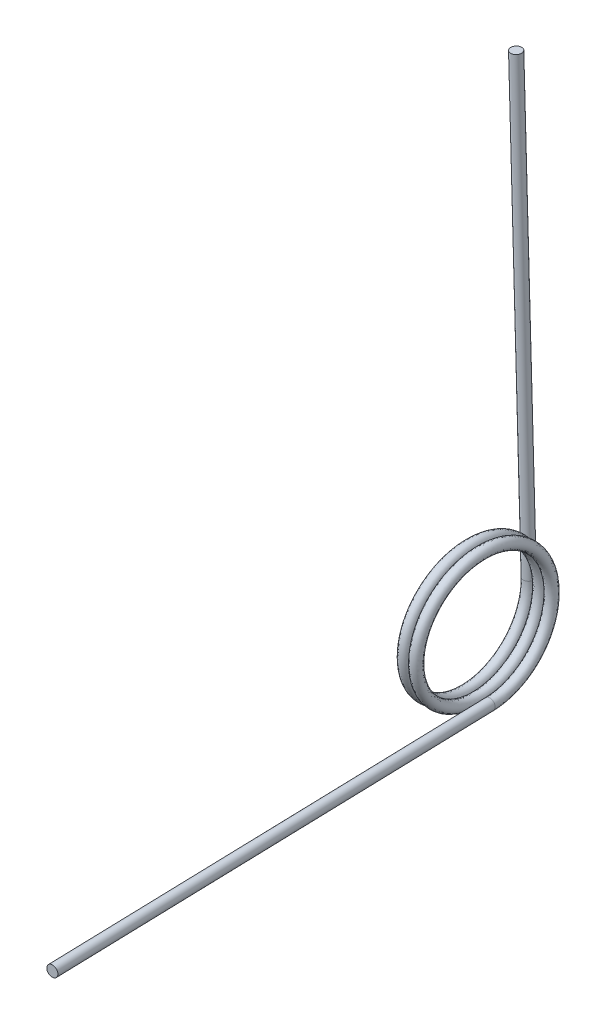
ISO-10303-21;
HEADER;
FILE_DESCRIPTION(('STEP AP214'),'2;1');
FILE_NAME('part.step','',(''),(''),'','','');
FILE_SCHEMA(('AUTOMOTIVE_DESIGN { 1 0 10303 214 1 1 1 1 }'));
ENDSEC;
DATA;
#1=APPLICATION_CONTEXT('core data for automotive mechanical design processes');
#2=APPLICATION_PROTOCOL_DEFINITION('international standard','automotive_design',2000,#1);
#3=PRODUCT_CONTEXT('',#1,'mechanical');
#4=PRODUCT('Part','Part','',(#3));
#5=PRODUCT_RELATED_PRODUCT_CATEGORY('part','',(#4));
#6=PRODUCT_DEFINITION_FORMATION('','',#4);
#7=PRODUCT_DEFINITION_CONTEXT('part definition',#1,'design');
#8=PRODUCT_DEFINITION('design','',#6,#7);
#9=PRODUCT_DEFINITION_SHAPE('','',#8);
#10=(LENGTH_UNIT() NAMED_UNIT(*) SI_UNIT(.MILLI.,.METRE.));
#11=(NAMED_UNIT(*) PLANE_ANGLE_UNIT() SI_UNIT($,.RADIAN.));
#12=(NAMED_UNIT(*) SI_UNIT($,.STERADIAN.) SOLID_ANGLE_UNIT());
#13=UNCERTAINTY_MEASURE_WITH_UNIT(LENGTH_MEASURE(1.E-05),#10,'distance_accuracy_value','');
#14=(GEOMETRIC_REPRESENTATION_CONTEXT(3) GLOBAL_UNCERTAINTY_ASSIGNED_CONTEXT((#13)) GLOBAL_UNIT_ASSIGNED_CONTEXT((#10,
#11,#12)) REPRESENTATION_CONTEXT('',''));
#15=CARTESIAN_POINT('',(0.,0.,0.));
#16=DIRECTION('',(0.,0.,1.));
#17=DIRECTION('',(1.,0.,0.));
#18=AXIS2_PLACEMENT_3D('',#15,#16,#17);
#19=CARTESIAN_POINT('',(0.228510444776798,0.00639817379493279,-2.7432));
#20=CARTESIAN_POINT('',(0.268727111443464,-1.57738908464605,-2.74689398736283));
#21=CARTESIAN_POINT('',(0.308943778110131,-2.372481800764,-1.37714098104424));
#22=CARTESIAN_POINT('',(0.349160444776797,-3.16757451688196,-0.00738797472565311));
#23=CARTESIAN_POINT('',(0.389377111443464,-2.37887997455894,1.36605901895576));
#24=CARTESIAN_POINT('',(0.42959377811013,-1.59018543223592,2.73950601263717));
#25=CARTESIAN_POINT('',(0.469810444776797,-0.00639817379493313,2.7432));
#26=CARTESIAN_POINT('',(0.510027111443464,1.57738908464605,2.74689398736283));
#27=CARTESIAN_POINT('',(0.55024377811013,2.372481800764,1.37714098104424));
#28=CARTESIAN_POINT('',(0.590460444776797,3.16757451688196,0.0073879747256535));
#29=CARTESIAN_POINT('',(0.630677111443463,2.37887997455894,-1.36605901895576));
#30=CARTESIAN_POINT('',(0.67089377811013,1.59018543223592,-2.73950601263717));
#31=CARTESIAN_POINT('',(0.711110444776796,0.00639817379493279,-2.7432));
#32=CARTESIAN_POINT('',(0.751327111443463,-1.57738908464605,-2.74689398736283));
#33=CARTESIAN_POINT('',(0.79154377811013,-2.372481800764,-1.37714098104424));
#34=CARTESIAN_POINT('',(0.831760444776796,-3.16757451688196,-0.00738797472565311));
#35=CARTESIAN_POINT('',(0.871977111443463,-2.37887997455894,1.36605901895576));
#36=CARTESIAN_POINT('',(0.912193778110129,-1.59018543223592,2.73950601263717));
#37=CARTESIAN_POINT('',(0.952410444776796,-0.00639817379493313,2.7432));
#38=CARTESIAN_POINT('',(0.992627111443462,1.57738908464605,2.74689398736283));
#39=CARTESIAN_POINT('',(1.03284377811013,2.372481800764,1.37714098104424));
#40=CARTESIAN_POINT('',(1.0730604447768,3.16757451688196,0.0073879747256535));
#41=CARTESIAN_POINT('',(1.11327711144346,2.37887997455894,-1.36605901895576));
#42=CARTESIAN_POINT('',(1.15349377811013,1.59018543223592,-2.73950601263717));
#43=CARTESIAN_POINT('',(1.1937104447768,0.00639817379493279,-2.7432));
#44=CARTESIAN_POINT('',(1.23392711144346,-1.57738908464605,-2.74689398736283));
#45=CARTESIAN_POINT('',(1.27414377811013,-2.372481800764,-1.37714098104424));
#46=CARTESIAN_POINT('',(1.31436044477679,-3.16757451688196,-0.00738797472565311));
#47=CARTESIAN_POINT('',(1.35457711144346,-2.37887997455894,1.36605901895576));
#48=CARTESIAN_POINT('',(1.39479377811013,-1.59018543223592,2.73950601263717));
#49=CARTESIAN_POINT('',(1.43501044477679,-0.00639817379493313,2.7432));
#50=CARTESIAN_POINT('',(1.47522711144346,1.57738908464605,2.74689398736283));
#51=CARTESIAN_POINT('',(1.51544377811013,2.372481800764,1.37714098104424));
#52=CARTESIAN_POINT('',(1.55566044477679,3.16757451688196,0.0073879747256535));
#53=CARTESIAN_POINT('',(1.59587711144346,2.37887997455894,-1.36605901895576));
#54=CARTESIAN_POINT('',(1.63609377811013,1.59018543223592,-2.73950601263717));
#55=CARTESIAN_POINT('',(1.67631044477679,0.00639817379493279,-2.7432));
#56=CARTESIAN_POINT('',(0.228510444776798,0.00639817379493279,-2.286));
#57=CARTESIAN_POINT('',(0.268727111443464,-1.31342454157255,-2.28969398736283));
#58=CARTESIAN_POINT('',(0.308943778110131,-1.97653498615376,-1.14854098104424));
#59=CARTESIAN_POINT('',(0.349160444776797,-2.63964543073497,-0.00738797472565308));
#60=CARTESIAN_POINT('',(0.389377111443464,-1.98293315994869,1.13745901895576));
#61=CARTESIAN_POINT('',(0.42959377811013,-1.32622088916242,2.28230601263717));
#62=CARTESIAN_POINT('',(0.469810444776797,-0.00639817379493308,2.286));
#63=CARTESIAN_POINT('',(0.510027111443464,1.31342454157255,2.28969398736283));
#64=CARTESIAN_POINT('',(0.55024377811013,1.97653498615376,1.14854098104424));
#65=CARTESIAN_POINT('',(0.590460444776797,2.63964543073497,0.0073879747256534));
#66=CARTESIAN_POINT('',(0.630677111443463,1.98293315994869,-1.13745901895576));
#67=CARTESIAN_POINT('',(0.67089377811013,1.32622088916242,-2.28230601263717));
#68=CARTESIAN_POINT('',(0.711110444776796,0.00639817379493279,-2.286));
#69=CARTESIAN_POINT('',(0.751327111443463,-1.31342454157255,-2.28969398736283));
#70=CARTESIAN_POINT('',(0.79154377811013,-1.97653498615376,-1.14854098104424));
#71=CARTESIAN_POINT('',(0.831760444776796,-2.63964543073497,-0.00738797472565308));
#72=CARTESIAN_POINT('',(0.871977111443463,-1.98293315994869,1.13745901895576));
#73=CARTESIAN_POINT('',(0.912193778110129,-1.32622088916242,2.28230601263717));
#74=CARTESIAN_POINT('',(0.952410444776796,-0.00639817379493308,2.286));
#75=CARTESIAN_POINT('',(0.992627111443462,1.31342454157255,2.28969398736283));
#76=CARTESIAN_POINT('',(1.03284377811013,1.97653498615376,1.14854098104424));
#77=CARTESIAN_POINT('',(1.0730604447768,2.63964543073497,0.0073879747256534));
#78=CARTESIAN_POINT('',(1.11327711144346,1.98293315994869,-1.13745901895576));
#79=CARTESIAN_POINT('',(1.15349377811013,1.32622088916242,-2.28230601263717));
#80=CARTESIAN_POINT('',(1.1937104447768,0.00639817379493279,-2.286));
#81=CARTESIAN_POINT('',(1.23392711144346,-1.31342454157255,-2.28969398736283));
#82=CARTESIAN_POINT('',(1.27414377811013,-1.97653498615376,-1.14854098104424));
#83=CARTESIAN_POINT('',(1.31436044477679,-2.63964543073497,-0.00738797472565308));
#84=CARTESIAN_POINT('',(1.35457711144346,-1.98293315994869,1.13745901895576));
#85=CARTESIAN_POINT('',(1.39479377811013,-1.32622088916242,2.28230601263717));
#86=CARTESIAN_POINT('',(1.43501044477679,-0.00639817379493308,2.286));
#87=CARTESIAN_POINT('',(1.47522711144346,1.31342454157255,2.28969398736283));
#88=CARTESIAN_POINT('',(1.51544377811013,1.97653498615376,1.14854098104424));
#89=CARTESIAN_POINT('',(1.55566044477679,2.63964543073497,0.0073879747256534));
#90=CARTESIAN_POINT('',(1.59587711144346,1.98293315994869,-1.13745901895576));
#91=CARTESIAN_POINT('',(1.63609377811013,1.32622088916242,-2.28230601263717));
#92=CARTESIAN_POINT('',(1.67631044477679,0.00639817379493279,-2.286));
#93=CARTESIAN_POINT('',(-0.228510444776798,-0.00639817379493279,-2.286));
#94=CARTESIAN_POINT('',(-0.188293778110131,-1.32622088916242,-2.28230601263717));
#95=CARTESIAN_POINT('',(-0.148077111443464,-1.98293315994869,-1.13745901895576));
#96=CARTESIAN_POINT('',(-0.107860444776798,-2.63964543073497,0.00738797472565275));
#97=CARTESIAN_POINT('',(-0.0676437781101313,-1.97653498615376,1.14854098104424));
#98=CARTESIAN_POINT('',(-0.0274271114434647,-1.31342454157255,2.28969398736283));
#99=CARTESIAN_POINT('',(0.0127895552232019,0.00639817379493251,2.286));
#100=CARTESIAN_POINT('',(0.0530062218898684,1.32622088916242,2.28230601263717));
#101=CARTESIAN_POINT('',(0.093222888556535,1.98293315994869,1.13745901895576));
#102=CARTESIAN_POINT('',(0.133439555223202,2.63964543073497,-0.00738797472565243));
#103=CARTESIAN_POINT('',(0.173656221889868,1.97653498615376,-1.14854098104424));
#104=CARTESIAN_POINT('',(0.213872888556535,1.31342454157255,-2.28969398736283));
#105=CARTESIAN_POINT('',(0.254089555223201,-0.00639817379493279,-2.286));
#106=CARTESIAN_POINT('',(0.294306221889868,-1.32622088916242,-2.28230601263717));
#107=CARTESIAN_POINT('',(0.334522888556534,-1.98293315994869,-1.13745901895576));
#108=CARTESIAN_POINT('',(0.374739555223201,-2.63964543073497,0.00738797472565275));
#109=CARTESIAN_POINT('',(0.414956221889868,-1.97653498615376,1.14854098104424));
#110=CARTESIAN_POINT('',(0.455172888556534,-1.31342454157255,2.28969398736283));
#111=CARTESIAN_POINT('',(0.495389555223201,0.00639817379493251,2.286));
#112=CARTESIAN_POINT('',(0.535606221889867,1.32622088916242,2.28230601263717));
#113=CARTESIAN_POINT('',(0.575822888556534,1.98293315994869,1.13745901895576));
#114=CARTESIAN_POINT('',(0.6160395552232,2.63964543073497,-0.00738797472565243));
#115=CARTESIAN_POINT('',(0.656256221889867,1.97653498615376,-1.14854098104424));
#116=CARTESIAN_POINT('',(0.696472888556534,1.31342454157255,-2.28969398736283));
#117=CARTESIAN_POINT('',(0.7366895552232,-0.00639817379493279,-2.286));
#118=CARTESIAN_POINT('',(0.776906221889867,-1.32622088916242,-2.28230601263717));
#119=CARTESIAN_POINT('',(0.817122888556533,-1.98293315994869,-1.13745901895576));
#120=CARTESIAN_POINT('',(0.8573395552232,-2.63964543073497,0.00738797472565275));
#121=CARTESIAN_POINT('',(0.897556221889866,-1.97653498615376,1.14854098104424));
#122=CARTESIAN_POINT('',(0.937772888556533,-1.31342454157255,2.28969398736283));
#123=CARTESIAN_POINT('',(0.9779895552232,0.00639817379493251,2.286));
#124=CARTESIAN_POINT('',(1.01820622188987,1.32622088916242,2.28230601263717));
#125=CARTESIAN_POINT('',(1.05842288855653,1.98293315994869,1.13745901895576));
#126=CARTESIAN_POINT('',(1.0986395552232,2.63964543073497,-0.00738797472565243));
#127=CARTESIAN_POINT('',(1.13885622188987,1.97653498615376,-1.14854098104424));
#128=CARTESIAN_POINT('',(1.17907288855653,1.31342454157255,-2.28969398736283));
#129=CARTESIAN_POINT('',(1.2192895552232,-0.00639817379493279,-2.286));
#130=CARTESIAN_POINT('',(-0.228510444776798,-0.00639817379493279,-2.7432));
#131=CARTESIAN_POINT('',(-0.188293778110131,-1.59018543223591,-2.73950601263717));
#132=CARTESIAN_POINT('',(-0.148077111443464,-2.37887997455894,-1.36605901895576));
#133=CARTESIAN_POINT('',(-0.107860444776798,-3.16757451688196,0.00738797472565272));
#134=CARTESIAN_POINT('',(-0.0676437781101313,-2.37248180076401,1.37714098104424));
#135=CARTESIAN_POINT('',(-0.0274271114434648,-1.57738908464605,2.74689398736282));
#136=CARTESIAN_POINT('',(0.0127895552232018,0.00639817379493246,2.7432));
#137=CARTESIAN_POINT('',(0.0530062218898684,1.59018543223591,2.73950601263717));
#138=CARTESIAN_POINT('',(0.0932228885565349,2.37887997455894,1.36605901895576));
#139=CARTESIAN_POINT('',(0.133439555223202,3.16757451688196,-0.00738797472565233));
#140=CARTESIAN_POINT('',(0.173656221889868,2.37248180076401,-1.37714098104424));
#141=CARTESIAN_POINT('',(0.213872888556535,1.57738908464605,-2.74689398736282));
#142=CARTESIAN_POINT('',(0.254089555223201,-0.00639817379493279,-2.7432));
#143=CARTESIAN_POINT('',(0.294306221889868,-1.59018543223591,-2.73950601263717));
#144=CARTESIAN_POINT('',(0.334522888556534,-2.37887997455894,-1.36605901895576));
#145=CARTESIAN_POINT('',(0.374739555223201,-3.16757451688196,0.00738797472565272));
#146=CARTESIAN_POINT('',(0.414956221889867,-2.37248180076401,1.37714098104424));
#147=CARTESIAN_POINT('',(0.455172888556534,-1.57738908464605,2.74689398736282));
#148=CARTESIAN_POINT('',(0.495389555223201,0.00639817379493246,2.7432));
#149=CARTESIAN_POINT('',(0.535606221889867,1.59018543223591,2.73950601263717));
#150=CARTESIAN_POINT('',(0.575822888556534,2.37887997455894,1.36605901895576));
#151=CARTESIAN_POINT('',(0.6160395552232,3.16757451688196,-0.00738797472565233));
#152=CARTESIAN_POINT('',(0.656256221889867,2.37248180076401,-1.37714098104424));
#153=CARTESIAN_POINT('',(0.696472888556534,1.57738908464605,-2.74689398736282));
#154=CARTESIAN_POINT('',(0.7366895552232,-0.00639817379493279,-2.7432));
#155=CARTESIAN_POINT('',(0.776906221889867,-1.59018543223591,-2.73950601263717));
#156=CARTESIAN_POINT('',(0.817122888556533,-2.37887997455894,-1.36605901895576));
#157=CARTESIAN_POINT('',(0.8573395552232,-3.16757451688196,0.00738797472565272));
#158=CARTESIAN_POINT('',(0.897556221889866,-2.37248180076401,1.37714098104424));
#159=CARTESIAN_POINT('',(0.937772888556533,-1.57738908464605,2.74689398736282));
#160=CARTESIAN_POINT('',(0.9779895552232,0.00639817379493246,2.7432));
#161=CARTESIAN_POINT('',(1.01820622188987,1.59018543223591,2.73950601263717));
#162=CARTESIAN_POINT('',(1.05842288855653,2.37887997455894,1.36605901895576));
#163=CARTESIAN_POINT('',(1.0986395552232,3.16757451688196,-0.00738797472565233));
#164=CARTESIAN_POINT('',(1.13885622188987,2.37248180076401,-1.37714098104424));
#165=CARTESIAN_POINT('',(1.17907288855653,1.57738908464605,-2.74689398736282));
#166=CARTESIAN_POINT('',(1.2192895552232,-0.00639817379493279,-2.7432));
#167=CARTESIAN_POINT('',(-0.228510444776798,-0.0063981737949328,-3.2004));
#168=CARTESIAN_POINT('',(-0.188293778110131,-1.85414997530941,-3.19670601263717));
#169=CARTESIAN_POINT('',(-0.148077111443465,-2.77482678916918,-1.59465901895576));
#170=CARTESIAN_POINT('',(-0.107860444776798,-3.69550360302896,0.00738797472565269));
#171=CARTESIAN_POINT('',(-0.0676437781101314,-2.76842861537425,1.60574098104424));
#172=CARTESIAN_POINT('',(-0.0274271114434648,-1.84135362771955,3.20409398736283));
#173=CARTESIAN_POINT('',(0.0127895552232018,0.0063981737949324,3.2004));
#174=CARTESIAN_POINT('',(0.0530062218898683,1.85414997530941,3.19670601263717));
#175=CARTESIAN_POINT('',(0.0932228885565349,2.77482678916918,1.59465901895576));
#176=CARTESIAN_POINT('',(0.133439555223201,3.69550360302896,-0.00738797472565224));
#177=CARTESIAN_POINT('',(0.173656221889868,2.76842861537425,-1.60574098104424));
#178=CARTESIAN_POINT('',(0.213872888556535,1.84135362771955,-3.20409398736283));
#179=CARTESIAN_POINT('',(0.254089555223201,-0.0063981737949328,-3.2004));
#180=CARTESIAN_POINT('',(0.294306221889868,-1.85414997530941,-3.19670601263717));
#181=CARTESIAN_POINT('',(0.334522888556534,-2.77482678916918,-1.59465901895576));
#182=CARTESIAN_POINT('',(0.374739555223201,-3.69550360302896,0.00738797472565269));
#183=CARTESIAN_POINT('',(0.414956221889867,-2.76842861537425,1.60574098104424));
#184=CARTESIAN_POINT('',(0.455172888556534,-1.84135362771955,3.20409398736283));
#185=CARTESIAN_POINT('',(0.495389555223201,0.0063981737949324,3.2004));
#186=CARTESIAN_POINT('',(0.535606221889867,1.85414997530941,3.19670601263717));
#187=CARTESIAN_POINT('',(0.575822888556534,2.77482678916918,1.59465901895576));
#188=CARTESIAN_POINT('',(0.6160395552232,3.69550360302896,-0.00738797472565224));
#189=CARTESIAN_POINT('',(0.656256221889867,2.76842861537425,-1.60574098104424));
#190=CARTESIAN_POINT('',(0.696472888556534,1.84135362771955,-3.20409398736283));
#191=CARTESIAN_POINT('',(0.7366895552232,-0.0063981737949328,-3.2004));
#192=CARTESIAN_POINT('',(0.776906221889867,-1.85414997530941,-3.19670601263717));
#193=CARTESIAN_POINT('',(0.817122888556533,-2.77482678916918,-1.59465901895576));
#194=CARTESIAN_POINT('',(0.8573395552232,-3.69550360302896,0.00738797472565269));
#195=CARTESIAN_POINT('',(0.897556221889866,-2.76842861537425,1.60574098104424));
#196=CARTESIAN_POINT('',(0.937772888556533,-1.84135362771955,3.20409398736283));
#197=CARTESIAN_POINT('',(0.977989555223199,0.0063981737949324,3.2004));
#198=CARTESIAN_POINT('',(1.01820622188987,1.85414997530941,3.19670601263717));
#199=CARTESIAN_POINT('',(1.05842288855653,2.77482678916918,1.59465901895576));
#200=CARTESIAN_POINT('',(1.0986395552232,3.69550360302896,-0.00738797472565224));
#201=CARTESIAN_POINT('',(1.13885622188987,2.76842861537425,-1.60574098104424));
#202=CARTESIAN_POINT('',(1.17907288855653,1.84135362771955,-3.20409398736283));
#203=CARTESIAN_POINT('',(1.2192895552232,-0.0063981737949328,-3.2004));
#204=CARTESIAN_POINT('',(0.228510444776798,0.00639817379493279,-3.2004));
#205=CARTESIAN_POINT('',(0.268727111443464,-1.84135362771954,-3.20409398736283));
#206=CARTESIAN_POINT('',(0.308943778110131,-2.76842861537425,-1.60574098104424));
#207=CARTESIAN_POINT('',(0.349160444776797,-3.69550360302896,-0.00738797472565314));
#208=CARTESIAN_POINT('',(0.389377111443464,-2.77482678916918,1.59465901895576));
#209=CARTESIAN_POINT('',(0.42959377811013,-1.85414997530941,3.19670601263717));
#210=CARTESIAN_POINT('',(0.469810444776797,-0.00639817379493319,3.2004));
#211=CARTESIAN_POINT('',(0.510027111443464,1.84135362771954,3.20409398736283));
#212=CARTESIAN_POINT('',(0.55024377811013,2.76842861537425,1.60574098104424));
#213=CARTESIAN_POINT('',(0.590460444776797,3.69550360302896,0.0073879747256536));
#214=CARTESIAN_POINT('',(0.630677111443463,2.77482678916918,-1.59465901895576));
#215=CARTESIAN_POINT('',(0.67089377811013,1.85414997530941,-3.19670601263717));
#216=CARTESIAN_POINT('',(0.711110444776796,0.00639817379493279,-3.2004));
#217=CARTESIAN_POINT('',(0.751327111443463,-1.84135362771954,-3.20409398736283));
#218=CARTESIAN_POINT('',(0.79154377811013,-2.76842861537425,-1.60574098104424));
#219=CARTESIAN_POINT('',(0.831760444776796,-3.69550360302896,-0.00738797472565314));
#220=CARTESIAN_POINT('',(0.871977111443463,-2.77482678916918,1.59465901895576));
#221=CARTESIAN_POINT('',(0.912193778110129,-1.85414997530941,3.19670601263717));
#222=CARTESIAN_POINT('',(0.952410444776796,-0.00639817379493319,3.2004));
#223=CARTESIAN_POINT('',(0.992627111443462,1.84135362771954,3.20409398736283));
#224=CARTESIAN_POINT('',(1.03284377811013,2.76842861537425,1.60574098104424));
#225=CARTESIAN_POINT('',(1.0730604447768,3.69550360302896,0.0073879747256536));
#226=CARTESIAN_POINT('',(1.11327711144346,2.77482678916918,-1.59465901895576));
#227=CARTESIAN_POINT('',(1.15349377811013,1.85414997530941,-3.19670601263717));
#228=CARTESIAN_POINT('',(1.1937104447768,0.00639817379493279,-3.2004));
#229=CARTESIAN_POINT('',(1.23392711144346,-1.84135362771954,-3.20409398736283));
#230=CARTESIAN_POINT('',(1.27414377811013,-2.76842861537425,-1.60574098104424));
#231=CARTESIAN_POINT('',(1.31436044477679,-3.69550360302896,-0.00738797472565314));
#232=CARTESIAN_POINT('',(1.35457711144346,-2.77482678916918,1.59465901895576));
#233=CARTESIAN_POINT('',(1.39479377811013,-1.85414997530941,3.19670601263717));
#234=CARTESIAN_POINT('',(1.43501044477679,-0.00639817379493319,3.2004));
#235=CARTESIAN_POINT('',(1.47522711144346,1.84135362771954,3.20409398736283));
#236=CARTESIAN_POINT('',(1.51544377811013,2.76842861537425,1.60574098104424));
#237=CARTESIAN_POINT('',(1.55566044477679,3.69550360302896,0.0073879747256536));
#238=CARTESIAN_POINT('',(1.59587711144346,2.77482678916918,-1.59465901895576));
#239=CARTESIAN_POINT('',(1.63609377811013,1.85414997530941,-3.19670601263717));
#240=CARTESIAN_POINT('',(1.67631044477679,0.00639817379493279,-3.2004));
#241=CARTESIAN_POINT('',(0.228510444776798,0.00639817379493279,-2.7432));
#242=CARTESIAN_POINT('',(0.268727111443464,-1.57738908464605,-2.74689398736283));
#243=CARTESIAN_POINT('',(0.308943778110131,-2.372481800764,-1.37714098104424));
#244=CARTESIAN_POINT('',(0.349160444776797,-3.16757451688196,-0.00738797472565311));
#245=CARTESIAN_POINT('',(0.389377111443464,-2.37887997455894,1.36605901895576));
#246=CARTESIAN_POINT('',(0.42959377811013,-1.59018543223592,2.73950601263717));
#247=CARTESIAN_POINT('',(0.469810444776797,-0.00639817379493313,2.7432));
#248=CARTESIAN_POINT('',(0.510027111443464,1.57738908464605,2.74689398736283));
#249=CARTESIAN_POINT('',(0.55024377811013,2.372481800764,1.37714098104424));
#250=CARTESIAN_POINT('',(0.590460444776797,3.16757451688196,0.0073879747256535));
#251=CARTESIAN_POINT('',(0.630677111443463,2.37887997455894,-1.36605901895576));
#252=CARTESIAN_POINT('',(0.67089377811013,1.59018543223592,-2.73950601263717));
#253=CARTESIAN_POINT('',(0.711110444776796,0.00639817379493279,-2.7432));
#254=CARTESIAN_POINT('',(0.751327111443463,-1.57738908464605,-2.74689398736283));
#255=CARTESIAN_POINT('',(0.79154377811013,-2.372481800764,-1.37714098104424));
#256=CARTESIAN_POINT('',(0.831760444776796,-3.16757451688196,-0.00738797472565311));
#257=CARTESIAN_POINT('',(0.871977111443463,-2.37887997455894,1.36605901895576));
#258=CARTESIAN_POINT('',(0.912193778110129,-1.59018543223592,2.73950601263717));
#259=CARTESIAN_POINT('',(0.952410444776796,-0.00639817379493313,2.7432));
#260=CARTESIAN_POINT('',(0.992627111443462,1.57738908464605,2.74689398736283));
#261=CARTESIAN_POINT('',(1.03284377811013,2.372481800764,1.37714098104424));
#262=CARTESIAN_POINT('',(1.0730604447768,3.16757451688196,0.0073879747256535));
#263=CARTESIAN_POINT('',(1.11327711144346,2.37887997455894,-1.36605901895576));
#264=CARTESIAN_POINT('',(1.15349377811013,1.59018543223592,-2.73950601263717));
#265=CARTESIAN_POINT('',(1.1937104447768,0.00639817379493279,-2.7432));
#266=CARTESIAN_POINT('',(1.23392711144346,-1.57738908464605,-2.74689398736283));
#267=CARTESIAN_POINT('',(1.27414377811013,-2.372481800764,-1.37714098104424));
#268=CARTESIAN_POINT('',(1.31436044477679,-3.16757451688196,-0.00738797472565311));
#269=CARTESIAN_POINT('',(1.35457711144346,-2.37887997455894,1.36605901895576));
#270=CARTESIAN_POINT('',(1.39479377811013,-1.59018543223592,2.73950601263717));
#271=CARTESIAN_POINT('',(1.43501044477679,-0.00639817379493313,2.7432));
#272=CARTESIAN_POINT('',(1.47522711144346,1.57738908464605,2.74689398736283));
#273=CARTESIAN_POINT('',(1.51544377811013,2.372481800764,1.37714098104424));
#274=CARTESIAN_POINT('',(1.55566044477679,3.16757451688196,0.0073879747256535));
#275=CARTESIAN_POINT('',(1.59587711144346,2.37887997455894,-1.36605901895576));
#276=CARTESIAN_POINT('',(1.63609377811013,1.59018543223592,-2.73950601263717));
#277=CARTESIAN_POINT('',(1.67631044477679,0.00639817379493279,-2.7432));
#278=(BOUNDED_SURFACE() B_SPLINE_SURFACE(3,2,((#19,#20,#21,#22,#23,#24,#25,#26,#27,#28,#29,#30,
#31,#32,#33,#34,#35,#36,#37,#38,#39,#40,#41,#42,#43,#44,#45,#46,#47,#48,#49,#50,#51,#52,#53,#54,
#55),(#56,#57,#58,#59,#60,#61,#62,#63,#64,#65,#66,#67,#68,#69,#70,#71,#72,#73,#74,#75,#76,#77,
#78,#79,#80,#81,#82,#83,#84,#85,#86,#87,#88,#89,#90,#91,#92),(#93,#94,#95,#96,#97,#98,#99,#100,
#101,#102,#103,#104,#105,#106,#107,#108,#109,#110,#111,#112,#113,#114,#115,#116,#117,#118,#119,
#120,#121,#122,#123,#124,#125,#126,#127,#128,#129),(#130,#131,#132,#133,#134,#135,#136,#137,
#138,#139,#140,#141,#142,#143,#144,#145,#146,#147,#148,#149,#150,#151,#152,#153,#154,#155,#156,
#157,#158,#159,#160,#161,#162,#163,#164,#165,#166),(#167,#168,#169,#170,#171,#172,#173,#174,
#175,#176,#177,#178,#179,#180,#181,#182,#183,#184,#185,#186,#187,#188,#189,#190,#191,#192,#193,
#194,#195,#196,#197,#198,#199,#200,#201,#202,#203),(#204,#205,#206,#207,#208,#209,#210,#211,
#212,#213,#214,#215,#216,#217,#218,#219,#220,#221,#222,#223,#224,#225,#226,#227,#228,#229,#230,
#231,#232,#233,#234,#235,#236,#237,#238,#239,#240),(#241,#242,#243,#244,#245,#246,#247,#248,
#249,#250,#251,#252,#253,#254,#255,#256,#257,#258,#259,#260,#261,#262,#263,#264,#265,#266,#267,
#268,#269,#270,#271,#272,#273,#274,#275,#276,#277)),.UNSPECIFIED.,.T.,.F.,
.F.) B_SPLINE_SURFACE_WITH_KNOTS((4,3,4),(3,2,2,2,2,2,2,2,2,2,2,2,2,2,2,2,2,2,3),(0.,0.5,1.),
(0.,0.0555555555555556,0.111111111111111,0.166666666666667,0.222222222222222,0.277777777777778,
0.333333333333333,0.388888888888889,0.444444444444444,0.5,0.555555555555556,0.611111111111111,
0.666666666666667,0.722222222222222,0.777777777777778,0.833333333333333,0.888888888888889,
0.944444444444444,1.),
.UNSPECIFIED.) GEOMETRIC_REPRESENTATION_ITEM() RATIONAL_B_SPLINE_SURFACE(((1.,0.866025403784439,
1.,0.866025403784439,1.,0.866025403784439,1.,0.866025403784439,1.,0.866025403784439,1.,
0.866025403784439,1.,0.866025403784439,1.,0.866025403784439,1.,0.866025403784439,1.,
0.866025403784439,1.,0.866025403784439,1.,0.866025403784439,1.,0.866025403784439,1.,
0.866025403784439,1.,0.866025403784439,1.,0.866025403784439,1.,0.866025403784439,1.,
0.866025403784439,1.),(0.333333333333333,0.288675134594813,0.333333333333333,0.288675134594813,
0.333333333333333,0.288675134594813,0.333333333333333,0.288675134594813,0.333333333333333,
0.288675134594813,0.333333333333333,0.288675134594813,0.333333333333333,0.288675134594813,
0.333333333333333,0.288675134594813,0.333333333333333,0.288675134594813,0.333333333333333,
0.288675134594813,0.333333333333333,0.288675134594813,0.333333333333333,0.288675134594813,
0.333333333333333,0.288675134594813,0.333333333333333,0.288675134594813,0.333333333333333,
0.288675134594813,0.333333333333333,0.288675134594813,0.333333333333333,0.288675134594813,
0.333333333333333,0.288675134594813,0.333333333333333),(0.333333333333333,0.288675134594813,
0.333333333333333,0.288675134594813,0.333333333333333,0.288675134594813,0.333333333333333,
0.288675134594813,0.333333333333333,0.288675134594813,0.333333333333333,0.288675134594813,
0.333333333333333,0.288675134594813,0.333333333333333,0.288675134594813,0.333333333333333,
0.288675134594813,0.333333333333333,0.288675134594813,0.333333333333333,0.288675134594813,
0.333333333333333,0.288675134594813,0.333333333333333,0.288675134594813,0.333333333333333,
0.288675134594813,0.333333333333333,0.288675134594813,0.333333333333333,0.288675134594813,
0.333333333333333,0.288675134594813,0.333333333333333,0.288675134594813,0.333333333333333),(1.,
0.866025403784439,1.,0.866025403784439,1.,0.866025403784439,1.,0.866025403784439,1.,
0.866025403784439,1.,0.866025403784439,1.,0.866025403784439,1.,0.866025403784439,1.,
0.866025403784439,1.,0.866025403784439,1.,0.866025403784439,1.,0.866025403784439,1.,
0.866025403784439,1.,0.866025403784439,1.,0.866025403784439,1.,0.866025403784439,1.,
0.866025403784439,1.,0.866025403784439,1.),(0.333333333333333,0.288675134594813,
0.333333333333333,0.288675134594813,0.333333333333333,0.288675134594813,0.333333333333333,
0.288675134594813,0.333333333333333,0.288675134594813,0.333333333333333,0.288675134594813,
0.333333333333333,0.288675134594813,0.333333333333333,0.288675134594813,0.333333333333333,
0.288675134594813,0.333333333333333,0.288675134594813,0.333333333333333,0.288675134594813,
0.333333333333333,0.288675134594813,0.333333333333333,0.288675134594813,0.333333333333333,
0.288675134594813,0.333333333333333,0.288675134594813,0.333333333333333,0.288675134594813,
0.333333333333333,0.288675134594813,0.333333333333333,0.288675134594813,0.333333333333333),
(0.333333333333333,0.288675134594813,0.333333333333333,0.288675134594813,0.333333333333333,
0.288675134594813,0.333333333333333,0.288675134594813,0.333333333333333,0.288675134594813,
0.333333333333333,0.288675134594813,0.333333333333333,0.288675134594813,0.333333333333333,
0.288675134594813,0.333333333333333,0.288675134594813,0.333333333333333,0.288675134594813,
0.333333333333333,0.288675134594813,0.333333333333333,0.288675134594813,0.333333333333333,
0.288675134594813,0.333333333333333,0.288675134594813,0.333333333333333,0.288675134594813,
0.333333333333333,0.288675134594813,0.333333333333333,0.288675134594813,0.333333333333333,
0.288675134594813,0.333333333333333),(1.,0.866025403784439,1.,0.866025403784439,1.,
0.866025403784439,1.,0.866025403784439,1.,0.866025403784439,1.,0.866025403784439,1.,
0.866025403784439,1.,0.866025403784439,1.,0.866025403784439,1.,0.866025403784439,1.,
0.866025403784439,1.,0.866025403784439,1.,0.866025403784439,1.,0.866025403784439,1.,
0.866025403784439,1.,0.866025403784439,1.,0.866025403784439,1.,0.866025403784439,1.))) REPRESENTATION_ITEM('') SURFACE());
#279=CARTESIAN_POINT('',(1.08585,-2.7432,0.));
#280=DIRECTION('',(0.0279885117888574,0.,0.999608244867881));
#281=DIRECTION('',(0.999608244867881,0.,-0.0279885117888574));
#282=AXIS2_PLACEMENT_3D('',#279,#280,#281);
#283=CIRCLE('',#282,0.2286);
#284=CARTESIAN_POINT('',(1.3143604447768,-2.7432,-0.00639817379484659));
#285=VERTEX_POINT('',#284);
#286=EDGE_CURVE('E10',#285,#285,#283,.T.);
#287=CARTESIAN_POINT('',(0.,0.,-2.7432));
#288=DIRECTION('',(0.0279885117888574,-0.999608244867881,0.));
#289=DIRECTION('',(0.999608244867881,0.0279885117888574,0.));
#290=AXIS2_PLACEMENT_3D('',#287,#288,#289);
#291=CIRCLE('',#290,0.2286);
#292=CARTESIAN_POINT('',(0.228510444776798,0.00639817379493279,-2.7432));
#293=VERTEX_POINT('',#292);
#294=EDGE_CURVE('E37',#293,#293,#291,.T.);
#295=ORIENTED_EDGE('',*,*,#286,.F.);
#296=EDGE_LOOP('',(#295));
#297=FACE_BOUND('',#296,.T.);
#298=ORIENTED_EDGE('',*,*,#294,.T.);
#299=EDGE_LOOP('',(#298));
#300=FACE_BOUND('',#299,.T.);
#301=ADVANCED_FACE('F29',(#297,#300),#278,.T.);
#302=CARTESIAN_POINT('',(-0.533181149577733,19.0425370647331,-2.7432));
#303=DIRECTION('',(0.0279885117888574,-0.999608244867881,0.));
#304=DIRECTION('',(0.999608244867881,0.0279885117888574,0.));
#305=AXIS2_PLACEMENT_3D('',#302,#303,#304);
#306=CYLINDRICAL_SURFACE('',#305,0.2286);
#307=CARTESIAN_POINT('',(-0.533181149577733,19.0425370647331,-2.7432));
#308=DIRECTION('',(-0.0279885117888574,0.999608244867881,0.));
#309=DIRECTION('',(-0.999608244867881,-0.0279885117888574,0.));
#310=AXIS2_PLACEMENT_3D('',#307,#308,#309);
#311=CIRCLE('',#310,0.2286);
#312=CARTESIAN_POINT('',(-0.76169159435453,19.0361388909382,-2.7432));
#313=VERTEX_POINT('',#312);
#314=EDGE_CURVE('E41',#313,#313,#311,.T.);
#315=ORIENTED_EDGE('',*,*,#314,.F.);
#316=EDGE_LOOP('',(#315));
#317=FACE_BOUND('',#316,.T.);
#318=ORIENTED_EDGE('',*,*,#294,.F.);
#319=EDGE_LOOP('',(#318));
#320=FACE_BOUND('',#319,.T.);
#321=ADVANCED_FACE('F62',(#317,#320),#306,.T.);
#322=CARTESIAN_POINT('',(-0.533181149577733,19.0425370647331,-2.7432));
#323=DIRECTION('',(-0.0279885117888574,0.999608244867881,0.));
#324=DIRECTION('',(-0.999608244867881,-0.0279885117888574,0.));
#325=AXIS2_PLACEMENT_3D('',#322,#323,#324);
#326=PLANE('',#325);
#327=ORIENTED_EDGE('',*,*,#314,.T.);
#328=EDGE_LOOP('',(#327));
#329=FACE_BOUND('',#328,.T.);
#330=ADVANCED_FACE('F55',(#329),#326,.T.);
#331=CARTESIAN_POINT('',(1.61903114957773,-2.7431999999994,19.0425370647332));
#332=DIRECTION('',(-0.0279885117888574,0.,-0.999608244867881));
#333=DIRECTION('',(-0.999608244867881,0.,0.0279885117888574));
#334=AXIS2_PLACEMENT_3D('',#331,#332,#333);
#335=CYLINDRICAL_SURFACE('',#334,0.2286);
#336=CARTESIAN_POINT('',(1.61903114957773,-2.7431999999994,19.0425370647332));
#337=DIRECTION('',(0.0279885117888574,0.,0.999608244867881));
#338=DIRECTION('',(0.999608244867881,0.,-0.0279885117888574));
#339=AXIS2_PLACEMENT_3D('',#336,#337,#338);
#340=CIRCLE('',#339,0.2286);
#341=CARTESIAN_POINT('',(1.84754159435453,-2.7431999999994,19.0361388909383));
#342=VERTEX_POINT('',#341);
#343=EDGE_CURVE('E45',#342,#342,#340,.T.);
#344=ORIENTED_EDGE('',*,*,#343,.F.);
#345=EDGE_LOOP('',(#344));
#346=FACE_BOUND('',#345,.T.);
#347=ORIENTED_EDGE('',*,*,#286,.T.);
#348=EDGE_LOOP('',(#347));
#349=FACE_BOUND('',#348,.T.);
#350=ADVANCED_FACE('F53',(#346,#349),#335,.T.);
#351=CARTESIAN_POINT('',(1.61903114957773,-2.7431999999994,19.0425370647332));
#352=DIRECTION('',(0.0279885117888574,0.,0.999608244867881));
#353=DIRECTION('',(0.999608244867881,0.,-0.0279885117888574));
#354=AXIS2_PLACEMENT_3D('',#351,#352,#353);
#355=PLANE('',#354);
#356=ORIENTED_EDGE('',*,*,#343,.T.);
#357=EDGE_LOOP('',(#356));
#358=FACE_BOUND('',#357,.T.);
#359=ADVANCED_FACE('F51',(#358),#355,.T.);
#360=CLOSED_SHELL('',(#301,#321,#330,#350,#359));
#361=MANIFOLD_SOLID_BREP('B2',#360);
#362=ADVANCED_BREP_SHAPE_REPRESENTATION('',(#18,#361),#14);
#363=SHAPE_DEFINITION_REPRESENTATION(#9,#362);
ENDSEC;
END-ISO-10303-21;
